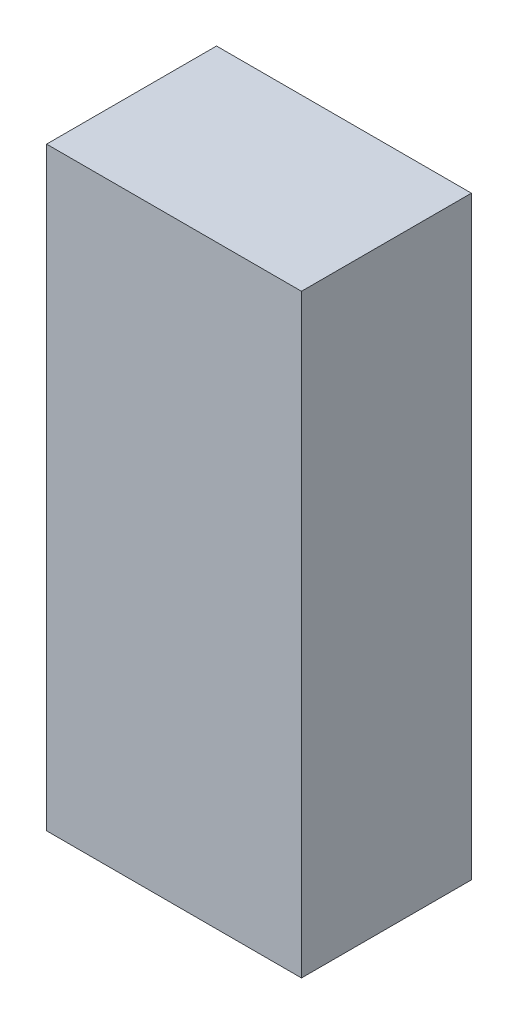
ISO-10303-21;
HEADER;
FILE_DESCRIPTION(('STEP AP214'),'2;1');
FILE_NAME('part.step','',(''),(''),'','','');
FILE_SCHEMA(('AUTOMOTIVE_DESIGN { 1 0 10303 214 1 1 1 1 }'));
ENDSEC;
DATA;
#1=APPLICATION_CONTEXT('core data for automotive mechanical design processes');
#2=APPLICATION_PROTOCOL_DEFINITION('international standard','automotive_design',2000,#1);
#3=PRODUCT_CONTEXT('',#1,'mechanical');
#4=PRODUCT('Part','Part','',(#3));
#5=PRODUCT_RELATED_PRODUCT_CATEGORY('part','',(#4));
#6=PRODUCT_DEFINITION_FORMATION('','',#4);
#7=PRODUCT_DEFINITION_CONTEXT('part definition',#1,'design');
#8=PRODUCT_DEFINITION('design','',#6,#7);
#9=PRODUCT_DEFINITION_SHAPE('','',#8);
#10=(LENGTH_UNIT() NAMED_UNIT(*) SI_UNIT(.MILLI.,.METRE.));
#11=(NAMED_UNIT(*) PLANE_ANGLE_UNIT() SI_UNIT($,.RADIAN.));
#12=(NAMED_UNIT(*) SI_UNIT($,.STERADIAN.) SOLID_ANGLE_UNIT());
#13=UNCERTAINTY_MEASURE_WITH_UNIT(LENGTH_MEASURE(1.E-05),#10,'distance_accuracy_value','');
#14=(GEOMETRIC_REPRESENTATION_CONTEXT(3) GLOBAL_UNCERTAINTY_ASSIGNED_CONTEXT((#13)) GLOBAL_UNIT_ASSIGNED_CONTEXT((#10,
#11,#12)) REPRESENTATION_CONTEXT('',''));
#15=CARTESIAN_POINT('',(0.,0.,0.));
#16=DIRECTION('',(0.,0.,1.));
#17=DIRECTION('',(1.,0.,0.));
#18=AXIS2_PLACEMENT_3D('',#15,#16,#17);
#19=CARTESIAN_POINT('',(1.5,7.,-1.));
#20=DIRECTION('',(-1.,0.,0.));
#21=DIRECTION('',(0.,0.,1.));
#22=AXIS2_PLACEMENT_3D('',#19,#20,#21);
#23=PLANE('',#22);
#24=DIRECTION('',(0.,0.,-1.));
#25=VECTOR('',#24,1.);
#26=CARTESIAN_POINT('',(1.5,0.,-1.));
#27=LINE('',#26,#25);
#28=CARTESIAN_POINT('',(1.5,0.,1.));
#29=VERTEX_POINT('',#28);
#30=CARTESIAN_POINT('',(1.5,0.,-1.));
#31=VERTEX_POINT('',#30);
#32=EDGE_CURVE('E113',#29,#31,#27,.T.);
#33=ORIENTED_EDGE('',*,*,#32,.T.);
#34=DIRECTION('',(0.,-1.,0.));
#35=VECTOR('',#34,1.);
#36=CARTESIAN_POINT('',(1.5,7.,-1.));
#37=LINE('',#36,#35);
#38=CARTESIAN_POINT('',(1.5,7.,-1.));
#39=VERTEX_POINT('',#38);
#40=EDGE_CURVE('E11',#39,#31,#37,.T.);
#41=ORIENTED_EDGE('',*,*,#40,.F.);
#42=DIRECTION('',(0.,0.,-1.));
#43=VECTOR('',#42,1.);
#44=CARTESIAN_POINT('',(1.5,7.,-1.));
#45=LINE('',#44,#43);
#46=CARTESIAN_POINT('',(1.5,7.,1.));
#47=VERTEX_POINT('',#46);
#48=EDGE_CURVE('E97',#47,#39,#45,.T.);
#49=ORIENTED_EDGE('',*,*,#48,.F.);
#50=DIRECTION('',(0.,-1.,0.));
#51=VECTOR('',#50,1.);
#52=CARTESIAN_POINT('',(1.5,7.,1.));
#53=LINE('',#52,#51);
#54=EDGE_CURVE('E109',#47,#29,#53,.T.);
#55=ORIENTED_EDGE('',*,*,#54,.T.);
#56=EDGE_LOOP('',(#33,#41,#49,#55));
#57=FACE_BOUND('',#56,.T.);
#58=ADVANCED_FACE('F45',(#57),#23,.F.);
#59=CARTESIAN_POINT('',(-1.5,7.,-1.));
#60=DIRECTION('',(0.,0.,1.));
#61=DIRECTION('',(1.,0.,0.));
#62=AXIS2_PLACEMENT_3D('',#59,#60,#61);
#63=PLANE('',#62);
#64=DIRECTION('',(-1.,0.,0.));
#65=VECTOR('',#64,1.);
#66=CARTESIAN_POINT('',(-1.5,0.,-1.));
#67=LINE('',#66,#65);
#68=CARTESIAN_POINT('',(-1.5,0.,-1.));
#69=VERTEX_POINT('',#68);
#70=EDGE_CURVE('E102',#31,#69,#67,.T.);
#71=ORIENTED_EDGE('',*,*,#70,.T.);
#72=DIRECTION('',(0.,-1.,0.));
#73=VECTOR('',#72,1.);
#74=CARTESIAN_POINT('',(-1.5,7.,-1.));
#75=LINE('',#74,#73);
#76=CARTESIAN_POINT('',(-1.5,7.,-1.));
#77=VERTEX_POINT('',#76);
#78=EDGE_CURVE('E54',#77,#69,#75,.T.);
#79=ORIENTED_EDGE('',*,*,#78,.F.);
#80=DIRECTION('',(-1.,0.,0.));
#81=VECTOR('',#80,1.);
#82=CARTESIAN_POINT('',(-1.5,7.,-1.));
#83=LINE('',#82,#81);
#84=EDGE_CURVE('E92',#39,#77,#83,.T.);
#85=ORIENTED_EDGE('',*,*,#84,.F.);
#86=ORIENTED_EDGE('',*,*,#40,.T.);
#87=EDGE_LOOP('',(#71,#79,#85,#86));
#88=FACE_BOUND('',#87,.T.);
#89=ADVANCED_FACE('F101',(#88),#63,.F.);
#90=CARTESIAN_POINT('',(-1.5,7.,-1.));
#91=DIRECTION('',(1.,0.,0.));
#92=DIRECTION('',(0.,0.,-1.));
#93=AXIS2_PLACEMENT_3D('',#90,#91,#92);
#94=PLANE('',#93);
#95=DIRECTION('',(0.,0.,1.));
#96=VECTOR('',#95,1.);
#97=CARTESIAN_POINT('',(-1.5,0.,-1.));
#98=LINE('',#97,#96);
#99=CARTESIAN_POINT('',(-1.5,0.,1.));
#100=VERTEX_POINT('',#99);
#101=EDGE_CURVE('E79',#69,#100,#98,.T.);
#102=ORIENTED_EDGE('',*,*,#101,.T.);
#103=DIRECTION('',(0.,-1.,0.));
#104=VECTOR('',#103,1.);
#105=CARTESIAN_POINT('',(-1.5,7.,1.));
#106=LINE('',#105,#104);
#107=CARTESIAN_POINT('',(-1.5,7.,1.));
#108=VERTEX_POINT('',#107);
#109=EDGE_CURVE('E104',#108,#100,#106,.T.);
#110=ORIENTED_EDGE('',*,*,#109,.F.);
#111=DIRECTION('',(0.,0.,1.));
#112=VECTOR('',#111,1.);
#113=CARTESIAN_POINT('',(-1.5,7.,-1.));
#114=LINE('',#113,#112);
#115=EDGE_CURVE('E95',#77,#108,#114,.T.);
#116=ORIENTED_EDGE('',*,*,#115,.F.);
#117=ORIENTED_EDGE('',*,*,#78,.T.);
#118=EDGE_LOOP('',(#102,#110,#116,#117));
#119=FACE_BOUND('',#118,.T.);
#120=ADVANCED_FACE('F105',(#119),#94,.F.);
#121=CARTESIAN_POINT('',(-1.5,7.,1.));
#122=DIRECTION('',(0.,0.,-1.));
#123=DIRECTION('',(-1.,0.,0.));
#124=AXIS2_PLACEMENT_3D('',#121,#122,#123);
#125=PLANE('',#124);
#126=DIRECTION('',(1.,0.,0.));
#127=VECTOR('',#126,1.);
#128=CARTESIAN_POINT('',(-1.5,0.,1.));
#129=LINE('',#128,#127);
#130=EDGE_CURVE('E85',#100,#29,#129,.T.);
#131=ORIENTED_EDGE('',*,*,#130,.T.);
#132=ORIENTED_EDGE('',*,*,#54,.F.);
#133=DIRECTION('',(1.,0.,0.));
#134=VECTOR('',#133,1.);
#135=CARTESIAN_POINT('',(-1.5,7.,1.));
#136=LINE('',#135,#134);
#137=EDGE_CURVE('E62',#108,#47,#136,.T.);
#138=ORIENTED_EDGE('',*,*,#137,.F.);
#139=ORIENTED_EDGE('',*,*,#109,.T.);
#140=EDGE_LOOP('',(#131,#132,#138,#139));
#141=FACE_BOUND('',#140,.T.);
#142=ADVANCED_FACE('F126',(#141),#125,.F.);
#143=CARTESIAN_POINT('',(0.,7.,0.));
#144=DIRECTION('',(0.,1.,0.));
#145=DIRECTION('',(0.,0.,1.));
#146=AXIS2_PLACEMENT_3D('',#143,#144,#145);
#147=PLANE('',#146);
#148=ORIENTED_EDGE('',*,*,#48,.T.);
#149=ORIENTED_EDGE('',*,*,#84,.T.);
#150=ORIENTED_EDGE('',*,*,#115,.T.);
#151=ORIENTED_EDGE('',*,*,#137,.T.);
#152=EDGE_LOOP('',(#148,#149,#150,#151));
#153=FACE_BOUND('',#152,.T.);
#154=ADVANCED_FACE('F93',(#153),#147,.T.);
#155=CARTESIAN_POINT('',(0.,0.,0.));
#156=DIRECTION('',(0.,1.,0.));
#157=DIRECTION('',(0.,0.,1.));
#158=AXIS2_PLACEMENT_3D('',#155,#156,#157);
#159=PLANE('',#158);
#160=ORIENTED_EDGE('',*,*,#32,.F.);
#161=ORIENTED_EDGE('',*,*,#130,.F.);
#162=ORIENTED_EDGE('',*,*,#101,.F.);
#163=ORIENTED_EDGE('',*,*,#70,.F.);
#164=EDGE_LOOP('',(#160,#161,#162,#163));
#165=FACE_BOUND('',#164,.T.);
#166=ADVANCED_FACE('F129',(#165),#159,.F.);
#167=CLOSED_SHELL('',(#58,#89,#120,#142,#154,#166));
#168=MANIFOLD_SOLID_BREP('B2',#167);
#169=ADVANCED_BREP_SHAPE_REPRESENTATION('',(#18,#168),#14);
#170=SHAPE_DEFINITION_REPRESENTATION(#9,#169);
ENDSEC;
END-ISO-10303-21;
